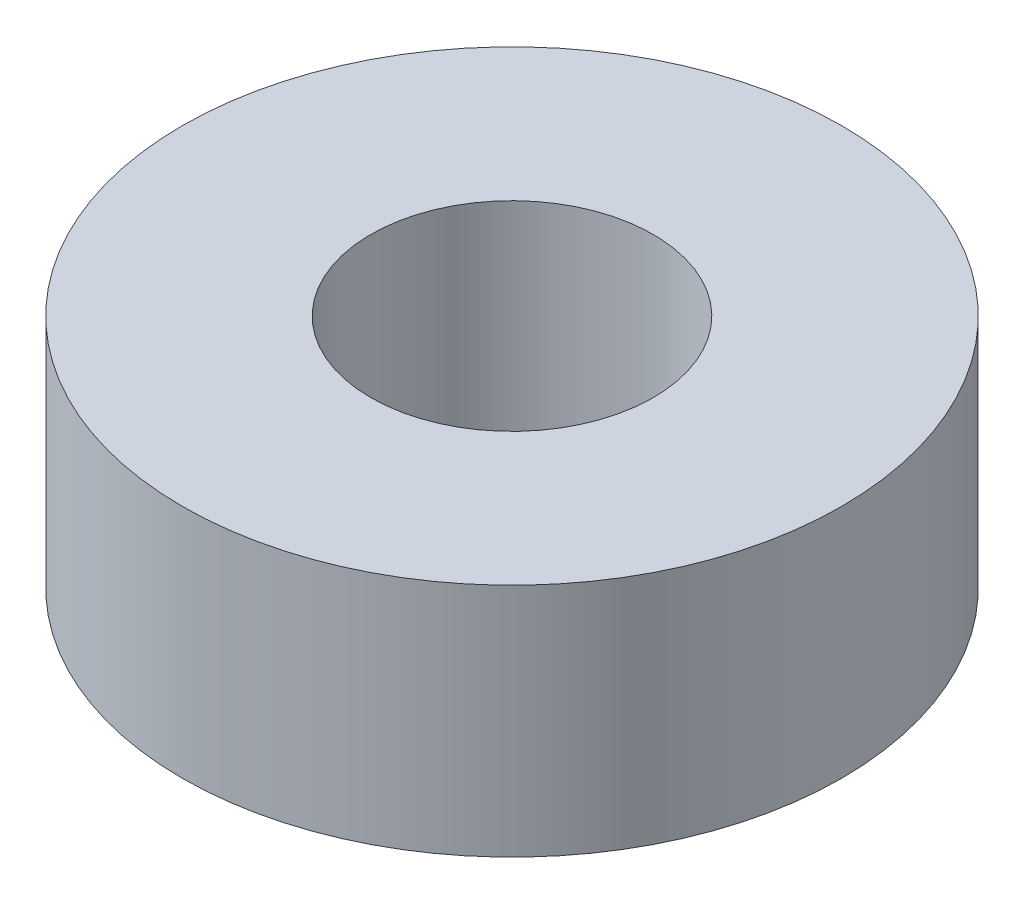
ISO-10303-21;
HEADER;
FILE_DESCRIPTION(('STEP AP214'),'2;1');
FILE_NAME('part.step','',(''),(''),'','','');
FILE_SCHEMA(('AUTOMOTIVE_DESIGN { 1 0 10303 214 1 1 1 1 }'));
ENDSEC;
DATA;
#1=APPLICATION_CONTEXT('core data for automotive mechanical design processes');
#2=APPLICATION_PROTOCOL_DEFINITION('international standard','automotive_design',2000,#1);
#3=PRODUCT_CONTEXT('',#1,'mechanical');
#4=PRODUCT('Part','Part','',(#3));
#5=PRODUCT_RELATED_PRODUCT_CATEGORY('part','',(#4));
#6=PRODUCT_DEFINITION_FORMATION('','',#4);
#7=PRODUCT_DEFINITION_CONTEXT('part definition',#1,'design');
#8=PRODUCT_DEFINITION('design','',#6,#7);
#9=PRODUCT_DEFINITION_SHAPE('','',#8);
#10=(LENGTH_UNIT() NAMED_UNIT(*) SI_UNIT(.MILLI.,.METRE.));
#11=(NAMED_UNIT(*) PLANE_ANGLE_UNIT() SI_UNIT($,.RADIAN.));
#12=(NAMED_UNIT(*) SI_UNIT($,.STERADIAN.) SOLID_ANGLE_UNIT());
#13=UNCERTAINTY_MEASURE_WITH_UNIT(LENGTH_MEASURE(1.E-05),#10,'distance_accuracy_value','');
#14=(GEOMETRIC_REPRESENTATION_CONTEXT(3) GLOBAL_UNCERTAINTY_ASSIGNED_CONTEXT((#13)) GLOBAL_UNIT_ASSIGNED_CONTEXT((#10,
#11,#12)) REPRESENTATION_CONTEXT('',''));
#15=CARTESIAN_POINT('',(0.,0.,0.));
#16=DIRECTION('',(0.,0.,1.));
#17=DIRECTION('',(1.,0.,0.));
#18=AXIS2_PLACEMENT_3D('',#15,#16,#17);
#19=CARTESIAN_POINT('',(0.,5.,0.));
#20=DIRECTION('',(0.,1.,0.));
#21=DIRECTION('',(0.,0.,1.));
#22=AXIS2_PLACEMENT_3D('',#19,#20,#21);
#23=PLANE('',#22);
#24=CARTESIAN_POINT('',(0.,5.,0.));
#25=DIRECTION('',(0.,1.,0.));
#26=DIRECTION('',(0.,0.,1.));
#27=AXIS2_PLACEMENT_3D('',#24,#25,#26);
#28=CIRCLE('',#27,7.);
#29=CARTESIAN_POINT('',(0.,5.,7.));
#30=VERTEX_POINT('',#29);
#31=EDGE_CURVE('E10',#30,#30,#28,.T.);
#32=ORIENTED_EDGE('',*,*,#31,.T.);
#33=EDGE_LOOP('',(#32));
#34=FACE_BOUND('',#33,.T.);
#35=CARTESIAN_POINT('',(0.,5.,0.));
#36=DIRECTION('',(0.,1.,0.));
#37=DIRECTION('',(0.,0.,1.));
#38=AXIS2_PLACEMENT_3D('',#35,#36,#37);
#39=CIRCLE('',#38,3.);
#40=CARTESIAN_POINT('',(0.,5.,3.));
#41=VERTEX_POINT('',#40);
#42=EDGE_CURVE('E49',#41,#41,#39,.T.);
#43=ORIENTED_EDGE('',*,*,#42,.F.);
#44=EDGE_LOOP('',(#43));
#45=FACE_BOUND('',#44,.T.);
#46=ADVANCED_FACE('F39',(#34,#45),#23,.T.);
#47=CARTESIAN_POINT('',(0.,0.,0.));
#48=DIRECTION('',(0.,1.,0.));
#49=DIRECTION('',(0.,0.,1.));
#50=AXIS2_PLACEMENT_3D('',#47,#48,#49);
#51=PLANE('',#50);
#52=CARTESIAN_POINT('',(0.,0.,0.));
#53=DIRECTION('',(0.,1.,0.));
#54=DIRECTION('',(0.,0.,1.));
#55=AXIS2_PLACEMENT_3D('',#52,#53,#54);
#56=CIRCLE('',#55,7.);
#57=CARTESIAN_POINT('',(0.,0.,7.));
#58=VERTEX_POINT('',#57);
#59=EDGE_CURVE('E43',#58,#58,#56,.T.);
#60=ORIENTED_EDGE('',*,*,#59,.F.);
#61=EDGE_LOOP('',(#60));
#62=FACE_BOUND('',#61,.T.);
#63=CARTESIAN_POINT('',(0.,0.,0.));
#64=DIRECTION('',(0.,1.,0.));
#65=DIRECTION('',(0.,0.,1.));
#66=AXIS2_PLACEMENT_3D('',#63,#64,#65);
#67=CIRCLE('',#66,3.);
#68=CARTESIAN_POINT('',(0.,0.,3.));
#69=VERTEX_POINT('',#68);
#70=EDGE_CURVE('E55',#69,#69,#67,.T.);
#71=ORIENTED_EDGE('',*,*,#70,.T.);
#72=EDGE_LOOP('',(#71));
#73=FACE_BOUND('',#72,.T.);
#74=ADVANCED_FACE('F65',(#62,#73),#51,.F.);
#75=CARTESIAN_POINT('',(0.,5.,0.));
#76=DIRECTION('',(0.,-1.,0.));
#77=DIRECTION('',(0.,0.,-1.));
#78=AXIS2_PLACEMENT_3D('',#75,#76,#77);
#79=CYLINDRICAL_SURFACE('',#78,7.);
#80=ORIENTED_EDGE('',*,*,#31,.F.);
#81=EDGE_LOOP('',(#80));
#82=FACE_BOUND('',#81,.T.);
#83=ORIENTED_EDGE('',*,*,#59,.T.);
#84=EDGE_LOOP('',(#83));
#85=FACE_BOUND('',#84,.T.);
#86=ADVANCED_FACE('F41',(#82,#85),#79,.T.);
#87=CARTESIAN_POINT('',(0.,5.,0.));
#88=DIRECTION('',(0.,-1.,0.));
#89=DIRECTION('',(0.,0.,-1.));
#90=AXIS2_PLACEMENT_3D('',#87,#88,#89);
#91=CYLINDRICAL_SURFACE('',#90,3.);
#92=ORIENTED_EDGE('',*,*,#42,.T.);
#93=EDGE_LOOP('',(#92));
#94=FACE_BOUND('',#93,.T.);
#95=ORIENTED_EDGE('',*,*,#70,.F.);
#96=EDGE_LOOP('',(#95));
#97=FACE_BOUND('',#96,.T.);
#98=ADVANCED_FACE('F59',(#94,#97),#91,.F.);
#99=CLOSED_SHELL('',(#46,#74,#86,#98));
#100=MANIFOLD_SOLID_BREP('B2',#99);
#101=ADVANCED_BREP_SHAPE_REPRESENTATION('',(#18,#100),#14);
#102=SHAPE_DEFINITION_REPRESENTATION(#9,#101);
ENDSEC;
END-ISO-10303-21;
